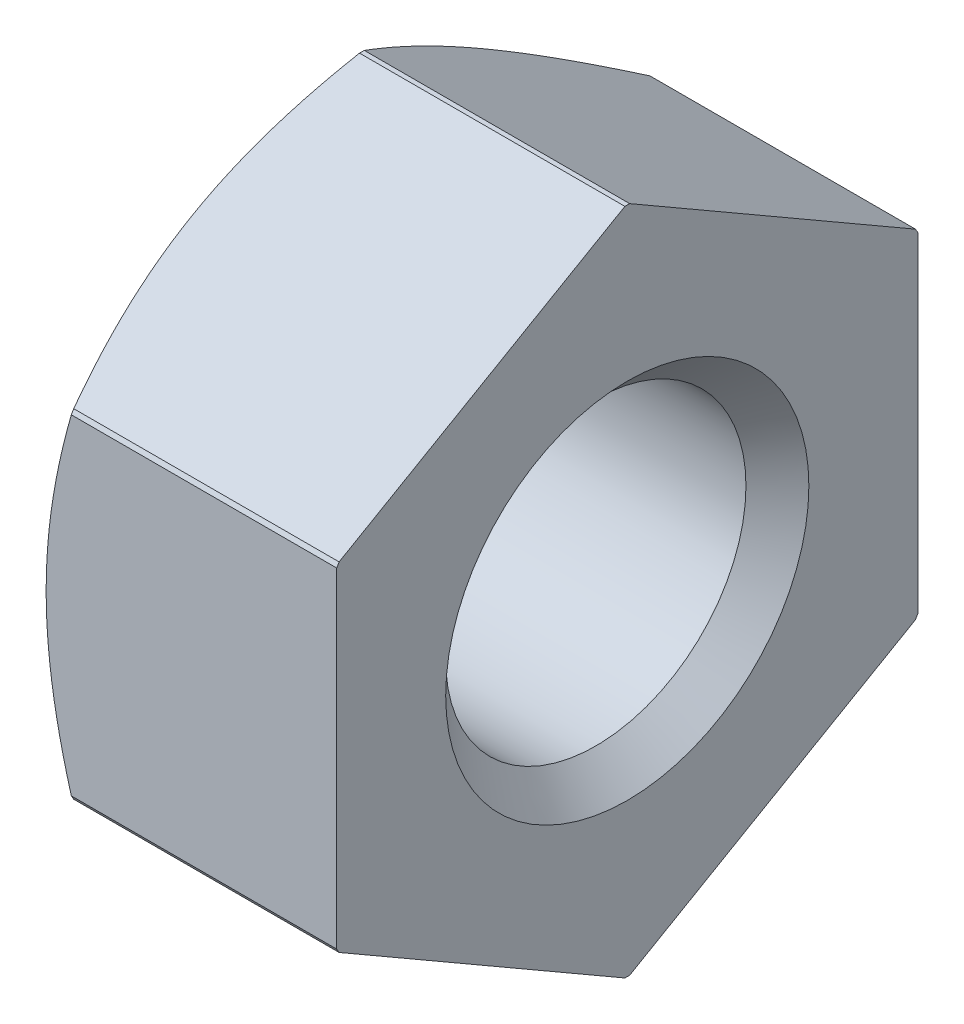
ISO-10303-21;
HEADER;
FILE_DESCRIPTION(('STEP AP214'),'2;1');
FILE_NAME('part.step','',(''),(''),'','','');
FILE_SCHEMA(('AUTOMOTIVE_DESIGN { 1 0 10303 214 1 1 1 1 }'));
ENDSEC;
DATA;
#1=APPLICATION_CONTEXT('core data for automotive mechanical design processes');
#2=APPLICATION_PROTOCOL_DEFINITION('international standard','automotive_design',2000,#1);
#3=PRODUCT_CONTEXT('',#1,'mechanical');
#4=PRODUCT('Part','Part','',(#3));
#5=PRODUCT_RELATED_PRODUCT_CATEGORY('part','',(#4));
#6=PRODUCT_DEFINITION_FORMATION('','',#4);
#7=PRODUCT_DEFINITION_CONTEXT('part definition',#1,'design');
#8=PRODUCT_DEFINITION('design','',#6,#7);
#9=PRODUCT_DEFINITION_SHAPE('','',#8);
#10=(LENGTH_UNIT() NAMED_UNIT(*) SI_UNIT(.MILLI.,.METRE.));
#11=(NAMED_UNIT(*) PLANE_ANGLE_UNIT() SI_UNIT($,.RADIAN.));
#12=(NAMED_UNIT(*) SI_UNIT($,.STERADIAN.) SOLID_ANGLE_UNIT());
#13=UNCERTAINTY_MEASURE_WITH_UNIT(LENGTH_MEASURE(1.E-05),#10,'distance_accuracy_value','');
#14=(GEOMETRIC_REPRESENTATION_CONTEXT(3) GLOBAL_UNCERTAINTY_ASSIGNED_CONTEXT((#13)) GLOBAL_UNIT_ASSIGNED_CONTEXT((#10,
#11,#12)) REPRESENTATION_CONTEXT('',''));
#15=CARTESIAN_POINT('',(0.,0.,0.));
#16=DIRECTION('',(0.,0.,1.));
#17=DIRECTION('',(1.,0.,0.));
#18=AXIS2_PLACEMENT_3D('',#15,#16,#17);
#19=CARTESIAN_POINT('',(-2.,2.,0.));
#20=DIRECTION('',(-1.,0.,0.));
#21=DIRECTION('',(0.,0.,1.));
#22=AXIS2_PLACEMENT_3D('',#19,#20,#21);
#23=PLANE('',#22);
#24=CARTESIAN_POINT('',(-2.00000000000955,0.,0.));
#25=DIRECTION('',(1.,0.,0.));
#26=DIRECTION('',(0.,0.,-1.));
#27=AXIS2_PLACEMENT_3D('',#24,#25,#26);
#28=CIRCLE('',#27,3.99999999996226);
#29=CARTESIAN_POINT('',(-1.99999999999865,0.,3.99999999998113));
#30=VERTEX_POINT('',#29);
#31=CARTESIAN_POINT('',(-1.99999999999865,-3.46410161512141,1.99999999999056));
#32=VERTEX_POINT('',#31);
#33=EDGE_CURVE('E335',#30,#32,#28,.T.);
#34=ORIENTED_EDGE('',*,*,#33,.F.);
#35=CARTESIAN_POINT('',(-2.00000000000955,0.,0.));
#36=DIRECTION('',(1.,0.,0.));
#37=DIRECTION('',(0.,0.,-1.));
#38=AXIS2_PLACEMENT_3D('',#35,#36,#37);
#39=CIRCLE('',#38,3.99999999996226);
#40=CARTESIAN_POINT('',(-1.99999999999865,3.46410161512141,1.99999999999057));
#41=VERTEX_POINT('',#40);
#42=EDGE_CURVE('E144',#41,#30,#39,.T.);
#43=ORIENTED_EDGE('',*,*,#42,.F.);
#44=CARTESIAN_POINT('',(-2.00000000000955,0.,0.));
#45=DIRECTION('',(1.,0.,0.));
#46=DIRECTION('',(0.,0.,-1.));
#47=AXIS2_PLACEMENT_3D('',#44,#45,#46);
#48=CIRCLE('',#47,3.99999999996226);
#49=CARTESIAN_POINT('',(-1.99999999999865,3.46410161512141,-1.99999999999056));
#50=VERTEX_POINT('',#49);
#51=EDGE_CURVE('E138',#50,#41,#48,.T.);
#52=ORIENTED_EDGE('',*,*,#51,.F.);
#53=CARTESIAN_POINT('',(-2.00000000000955,0.,0.));
#54=DIRECTION('',(1.,0.,0.));
#55=DIRECTION('',(0.,0.,-1.));
#56=AXIS2_PLACEMENT_3D('',#53,#54,#55);
#57=CIRCLE('',#56,3.99999999996226);
#58=CARTESIAN_POINT('',(-1.99999999999865,0.,-3.99999999998113));
#59=VERTEX_POINT('',#58);
#60=EDGE_CURVE('E141',#59,#50,#57,.T.);
#61=ORIENTED_EDGE('',*,*,#60,.F.);
#62=CARTESIAN_POINT('',(-2.00000000000955,0.,0.));
#63=DIRECTION('',(1.,0.,0.));
#64=DIRECTION('',(0.,0.,-1.));
#65=AXIS2_PLACEMENT_3D('',#62,#63,#64);
#66=CIRCLE('',#65,3.99999999996226);
#67=CARTESIAN_POINT('',(-1.99999999999866,-3.46410161512141,-1.99999999999056));
#68=VERTEX_POINT('',#67);
#69=EDGE_CURVE('E160',#68,#59,#66,.T.);
#70=ORIENTED_EDGE('',*,*,#69,.F.);
#71=CARTESIAN_POINT('',(-2.00000000000955,0.,0.));
#72=DIRECTION('',(1.,0.,0.));
#73=DIRECTION('',(0.,0.,-1.));
#74=AXIS2_PLACEMENT_3D('',#71,#72,#73);
#75=CIRCLE('',#74,3.99999999996226);
#76=EDGE_CURVE('E319',#32,#68,#75,.T.);
#77=ORIENTED_EDGE('',*,*,#76,.F.);
#78=EDGE_LOOP('',(#34,#43,#52,#61,#70,#77));
#79=FACE_BOUND('',#78,.T.);
#80=CARTESIAN_POINT('',(-2.00000000000955,0.,0.));
#81=DIRECTION('',(-1.,0.,0.));
#82=DIRECTION('',(0.,0.,1.));
#83=AXIS2_PLACEMENT_3D('',#80,#81,#82);
#84=CIRCLE('',#83,2.49999999999773);
#85=CARTESIAN_POINT('',(-2.00000000000955,0.,2.49999999999773));
#86=VERTEX_POINT('',#85);
#87=EDGE_CURVE('E20',#86,#86,#84,.F.);
#88=ORIENTED_EDGE('',*,*,#87,.T.);
#89=EDGE_LOOP('',(#88));
#90=FACE_BOUND('',#89,.T.);
#91=ADVANCED_FACE('F17',(#79,#90),#23,.T.);
#92=CARTESIAN_POINT('',(-2.00000000006639,0.,0.));
#93=DIRECTION('',(-1.,0.,0.));
#94=DIRECTION('',(0.,0.,1.));
#95=AXIS2_PLACEMENT_3D('',#92,#93,#94);
#96=CONICAL_SURFACE('',#95,2.50000000005457,0.785398163397448);
#97=CARTESIAN_POINT('',(-1.567,0.,0.));
#98=DIRECTION('',(1.,0.,0.));
#99=DIRECTION('',(0.,0.,-1.));
#100=AXIS2_PLACEMENT_3D('',#97,#98,#99);
#101=CIRCLE('',#100,2.067);
#102=CARTESIAN_POINT('',(-1.567,0.,-2.067));
#103=VERTEX_POINT('',#102);
#104=EDGE_CURVE('E153',#103,#103,#101,.T.);
#105=ORIENTED_EDGE('',*,*,#104,.T.);
#106=EDGE_LOOP('',(#105));
#107=FACE_BOUND('',#106,.T.);
#108=ORIENTED_EDGE('',*,*,#87,.F.);
#109=EDGE_LOOP('',(#108));
#110=FACE_BOUND('',#109,.T.);
#111=ADVANCED_FACE('F411',(#107,#110),#96,.F.);
#112=CARTESIAN_POINT('',(-1.65358983849728,0.,0.));
#113=DIRECTION('',(1.,0.,0.));
#114=DIRECTION('',(0.,0.,-1.));
#115=AXIS2_PLACEMENT_3D('',#112,#113,#114);
#116=CONICAL_SURFACE('',#115,4.59999999998217,1.04719755121286);
#117=CARTESIAN_POINT('',(-1.99999999998618,3.46410161513539,1.99999999999864));
#118=CARTESIAN_POINT('',(-2.00001528982485,3.51228454323559,1.91654472047514));
#119=CARTESIAN_POINT('',(-1.99798980459572,3.56046529591652,1.83309320888629));
#120=CARTESIAN_POINT('',(-1.98997086315159,3.65673560713573,1.6663481385952));
#121=CARTESIAN_POINT('',(-1.98397814173186,3.70482518090798,1.58305455350695));
#122=CARTESIAN_POINT('',(-1.96817687570405,3.80060992221482,1.41715051497338));
#123=CARTESIAN_POINT('',(-1.95838709370351,3.84830586925309,1.3345387113881));
#124=CARTESIAN_POINT('',(-1.93519618314512,3.94347716290588,1.16969719535948));
#125=CARTESIAN_POINT('',(-1.92179496829751,3.99095250422179,1.08746749209362));
#126=CARTESIAN_POINT('',(-1.87657493968299,4.13285817557247,0.841679659432025));
#127=CARTESIAN_POINT('',(-1.83971891567536,4.22688754609482,0.678816012283612));
#128=CARTESIAN_POINT('',(-1.75463489372951,4.41415290148489,0.354462902250597));
#129=CARTESIAN_POINT('',(-1.70635141411298,4.50738264048925,0.192984257518677));
#130=CARTESIAN_POINT('',(-1.65358983848693,4.59988328429791,0.0327684427092212));
#131=B_SPLINE_CURVE_WITH_KNOTS('',3,(#117,#118,#119,#120,#121,#122,#123,#124,#125,#126,#127,
#128,#129,#130),.UNSPECIFIED.,.F.,.F.,(4,2,2,2,2,2,4),(0.,0.289069278708792,0.578085032160999,
0.865690487404775,1.15330281515855,1.72781024307218,2.3051663615993),.UNSPECIFIED.);
#132=CARTESIAN_POINT('',(-1.65358983848658,4.59988328429786,0.032768442709309));
#133=VERTEX_POINT('',#132);
#134=EDGE_CURVE('E273',#41,#133,#131,.T.);
#135=ORIENTED_EDGE('',*,*,#134,.T.);
#136=CARTESIAN_POINT('',(-1.65358983848622,0.,0.));
#137=DIRECTION('',(1.,0.,0.));
#138=DIRECTION('',(0.,0.,-1.));
#139=AXIS2_PLACEMENT_3D('',#136,#137,#138);
#140=CIRCLE('',#139,4.6);
#141=CARTESIAN_POINT('',(-1.6535898384866,4.59988328429781,-0.0327684427094049));
#142=VERTEX_POINT('',#141);
#143=EDGE_CURVE('E134',#142,#133,#140,.T.);
#144=ORIENTED_EDGE('',*,*,#143,.F.);
#145=CARTESIAN_POINT('',(-1.65358983848693,4.59988328429791,-0.0327684427092265));
#146=CARTESIAN_POINT('',(-1.70635141411296,4.50738264048926,-0.192984257518654));
#147=CARTESIAN_POINT('',(-1.75463489372949,4.41415290148492,-0.354462902250555));
#148=CARTESIAN_POINT('',(-1.83971891567534,4.22688754609488,-0.678816012283549));
#149=CARTESIAN_POINT('',(-1.87657493968298,4.13285817557254,-0.841679659431959));
#150=CARTESIAN_POINT('',(-1.92179496829748,3.99095250422185,-1.08746749209352));
#151=CARTESIAN_POINT('',(-1.93519618314509,3.94347716290594,-1.16969719535935));
#152=CARTESIAN_POINT('',(-1.9583870937035,3.8483058692532,-1.33453871138796));
#153=CARTESIAN_POINT('',(-1.96817687570406,3.80060992221498,-1.41715051497326));
#154=CARTESIAN_POINT('',(-1.9839781417318,3.70482518090805,-1.58305455350671));
#155=CARTESIAN_POINT('',(-1.98997086315142,3.65673560713565,-1.66634813859485));
#156=CARTESIAN_POINT('',(-1.99798980459586,3.56046529591693,-1.83309320888613));
#157=CARTESIAN_POINT('',(-2.00001528982541,3.51228454323664,-1.9165447204753));
#158=CARTESIAN_POINT('',(-1.99999999998776,3.46410161513798,-1.99999999999961));
#159=B_SPLINE_CURVE_WITH_KNOTS('',3,(#145,#146,#147,#148,#149,#150,#151,#152,#153,#154,#155,
#156,#157,#158),.UNSPECIFIED.,.F.,.F.,(4,2,2,2,2,2,4),(0.,0.577356118527042,1.15186354644065,
1.43947587419436,1.72708132943809,2.01609708289021,2.30516636159888),.UNSPECIFIED.);
#160=EDGE_CURVE('E148',#142,#50,#159,.T.);
#161=ORIENTED_EDGE('',*,*,#160,.T.);
#162=ORIENTED_EDGE('',*,*,#51,.T.);
#163=EDGE_LOOP('',(#135,#144,#161,#162));
#164=FACE_BOUND('',#163,.T.);
#165=ADVANCED_FACE('F149',(#164),#116,.T.);
#166=CARTESIAN_POINT('',(0.173205080756888,0.,0.));
#167=DIRECTION('',(1.,0.,0.));
#168=DIRECTION('',(0.,0.,-1.));
#169=AXIS2_PLACEMENT_3D('',#166,#167,#168);
#170=CYLINDRICAL_SURFACE('',#169,4.6);
#171=DIRECTION('',(1.,0.,0.));
#172=VECTOR('',#171,1.);
#173=CARTESIAN_POINT('',(2.,4.59988328429781,0.0327684427093968));
#174=LINE('',#173,#172);
#175=CARTESIAN_POINT('',(2.,4.59988328429781,0.0327684427093985));
#176=VERTEX_POINT('',#175);
#177=EDGE_CURVE('E378',#133,#176,#174,.T.);
#178=ORIENTED_EDGE('',*,*,#177,.T.);
#179=CARTESIAN_POINT('',(2.,0.,0.));
#180=DIRECTION('',(1.,0.,0.));
#181=DIRECTION('',(0.,0.,-1.));
#182=AXIS2_PLACEMENT_3D('',#179,#180,#181);
#183=CIRCLE('',#182,4.6);
#184=CARTESIAN_POINT('',(2.,4.59988328429781,-0.032768442709401));
#185=VERTEX_POINT('',#184);
#186=EDGE_CURVE('E96',#176,#185,#183,.F.);
#187=ORIENTED_EDGE('',*,*,#186,.T.);
#188=DIRECTION('',(1.,0.,0.));
#189=VECTOR('',#188,1.);
#190=CARTESIAN_POINT('',(2.,4.59988328429781,-0.0327684427094017));
#191=LINE('',#190,#189);
#192=EDGE_CURVE('E168',#185,#142,#191,.F.);
#193=ORIENTED_EDGE('',*,*,#192,.T.);
#194=ORIENTED_EDGE('',*,*,#143,.T.);
#195=EDGE_LOOP('',(#178,#187,#193,#194));
#196=FACE_BOUND('',#195,.T.);
#197=ADVANCED_FACE('F404',(#196),#170,.T.);
#198=CARTESIAN_POINT('',(-1.65358983849728,0.,0.));
#199=DIRECTION('',(1.,0.,0.));
#200=DIRECTION('',(0.,0.,-1.));
#201=AXIS2_PLACEMENT_3D('',#198,#199,#200);
#202=CONICAL_SURFACE('',#201,4.59999999998217,1.04719755121286);
#203=CARTESIAN_POINT('',(-1.65358983848693,2.3283199459776,3.96723155729077));
#204=CARTESIAN_POINT('',(-1.70635141411297,2.42082058978626,3.80701574248135));
#205=CARTESIAN_POINT('',(-1.7546348937295,2.51405032879059,3.64553709774945));
#206=CARTESIAN_POINT('',(-1.83971891567535,2.70131568418063,3.32118398771645));
#207=CARTESIAN_POINT('',(-1.87657493968298,2.79534505470297,3.15832034056804));
#208=CARTESIAN_POINT('',(-1.92179496829749,2.93725072605366,2.91253250790648));
#209=CARTESIAN_POINT('',(-1.93519618314509,2.98472606736957,2.83030280464065));
#210=CARTESIAN_POINT('',(-1.9583870937035,3.07989736102231,2.66546128861204));
#211=CARTESIAN_POINT('',(-1.96817687570407,3.12759330806053,2.58284948502674));
#212=CARTESIAN_POINT('',(-1.98397814173181,3.22337804936746,2.41694544649329));
#213=CARTESIAN_POINT('',(-1.98997086315142,3.27146762313986,2.33365186140516));
#214=CARTESIAN_POINT('',(-1.99798980459586,3.36773793435858,2.16690679111387));
#215=CARTESIAN_POINT('',(-2.00001528982541,3.41591868703887,2.0834552795247));
#216=CARTESIAN_POINT('',(-1.99999999998776,3.46410161513753,2.00000000000039));
#217=B_SPLINE_CURVE_WITH_KNOTS('',3,(#203,#204,#205,#206,#207,#208,#209,#210,#211,#212,#213,
#214,#215,#216),.UNSPECIFIED.,.F.,.F.,(4,2,2,2,2,2,4),(0.,0.577356118527042,1.15186354644065,
1.43947587419436,1.72708132943809,2.01609708289021,2.30516636159888),.UNSPECIFIED.);
#218=CARTESIAN_POINT('',(-1.65358983848661,2.3283199459777,3.9672315572906));
#219=VERTEX_POINT('',#218);
#220=EDGE_CURVE('E176',#219,#41,#217,.T.);
#221=ORIENTED_EDGE('',*,*,#220,.T.);
#222=ORIENTED_EDGE('',*,*,#42,.T.);
#223=CARTESIAN_POINT('',(-1.99999999998618,0.,3.99999999999727));
#224=CARTESIAN_POINT('',(-2.00001528982485,0.0963658561973798,3.99999999999902));
#225=CARTESIAN_POINT('',(-1.99798980459572,0.192727361557999,3.99999999999974));
#226=CARTESIAN_POINT('',(-1.98997086315159,0.385267983995511,4.00000000000026));
#227=CARTESIAN_POINT('',(-1.98397814173186,0.481447131540342,4.00000000000007));
#228=CARTESIAN_POINT('',(-1.96817687570404,0.673016614154261,3.99999999999993));
#229=CARTESIAN_POINT('',(-1.95838709370351,0.768408508230703,3.99999999999998));
#230=CARTESIAN_POINT('',(-1.93519618314512,0.958751095536223,4.00000000000002));
#231=CARTESIAN_POINT('',(-1.92179496829751,1.05370177816807,4.00000000000001));
#232=CARTESIAN_POINT('',(-1.87657493968299,1.33751312086947,3.99999999999999));
#233=CARTESIAN_POINT('',(-1.83971891567536,1.52557186191415,3.99999999999999));
#234=CARTESIAN_POINT('',(-1.75463489372951,1.90010257269427,4.00000000000001));
#235=CARTESIAN_POINT('',(-1.70635141411298,2.08656205070297,4.00000000000001));
#236=CARTESIAN_POINT('',(-1.65358983848693,2.27156333832031,4.));
#237=B_SPLINE_CURVE_WITH_KNOTS('',3,(#223,#224,#225,#226,#227,#228,#229,#230,#231,#232,#233,
#234,#235,#236),.UNSPECIFIED.,.F.,.F.,(4,2,2,2,2,2,4),(0.,0.289069278708791,0.578085032160998,
0.865690487404773,1.15330281515855,1.72781024307218,2.3051663615993),.UNSPECIFIED.);
#238=CARTESIAN_POINT('',(-1.65358983848658,2.27156333832021,4.));
#239=VERTEX_POINT('',#238);
#240=EDGE_CURVE('E268',#30,#239,#237,.T.);
#241=ORIENTED_EDGE('',*,*,#240,.T.);
#242=CARTESIAN_POINT('',(-1.65358983848622,0.,0.));
#243=DIRECTION('',(1.,0.,0.));
#244=DIRECTION('',(0.,0.,-1.));
#245=AXIS2_PLACEMENT_3D('',#242,#243,#244);
#246=CIRCLE('',#245,4.6);
#247=EDGE_CURVE('E332',#219,#239,#246,.T.);
#248=ORIENTED_EDGE('',*,*,#247,.F.);
#249=EDGE_LOOP('',(#221,#222,#241,#248));
#250=FACE_BOUND('',#249,.T.);
#251=ADVANCED_FACE('F361',(#250),#202,.T.);
#252=CARTESIAN_POINT('',(0.173205080756888,0.,0.));
#253=DIRECTION('',(1.,0.,0.));
#254=DIRECTION('',(0.,0.,-1.));
#255=AXIS2_PLACEMENT_3D('',#252,#253,#254);
#256=CYLINDRICAL_SURFACE('',#255,4.6);
#257=DIRECTION('',(1.,0.,0.));
#258=VECTOR('',#257,1.);
#259=CARTESIAN_POINT('',(2.,2.3283199459777,3.9672315572906));
#260=LINE('',#259,#258);
#261=CARTESIAN_POINT('',(2.,2.3283199459777,3.9672315572906));
#262=VERTEX_POINT('',#261);
#263=EDGE_CURVE('E269',#262,#219,#260,.F.);
#264=ORIENTED_EDGE('',*,*,#263,.T.);
#265=ORIENTED_EDGE('',*,*,#247,.T.);
#266=DIRECTION('',(-1.,0.,0.));
#267=VECTOR('',#266,1.);
#268=CARTESIAN_POINT('',(2.,2.27156333832011,4.));
#269=LINE('',#268,#267);
#270=CARTESIAN_POINT('',(2.,2.27156333832011,4.));
#271=VERTEX_POINT('',#270);
#272=EDGE_CURVE('E368',#239,#271,#269,.F.);
#273=ORIENTED_EDGE('',*,*,#272,.T.);
#274=CARTESIAN_POINT('',(2.,0.,0.));
#275=DIRECTION('',(1.,0.,0.));
#276=DIRECTION('',(0.,0.,-1.));
#277=AXIS2_PLACEMENT_3D('',#274,#275,#276);
#278=CIRCLE('',#277,4.6);
#279=EDGE_CURVE('E336',#271,#262,#278,.F.);
#280=ORIENTED_EDGE('',*,*,#279,.T.);
#281=EDGE_LOOP('',(#264,#265,#273,#280));
#282=FACE_BOUND('',#281,.T.);
#283=ADVANCED_FACE('F259',(#282),#256,.T.);
#284=CARTESIAN_POINT('',(-1.65358983849728,0.,0.));
#285=DIRECTION('',(1.,0.,0.));
#286=DIRECTION('',(0.,0.,-1.));
#287=AXIS2_PLACEMENT_3D('',#284,#285,#286);
#288=CONICAL_SURFACE('',#287,4.59999999998217,1.04719755121286);
#289=CARTESIAN_POINT('',(-1.65358983848693,-2.27156333832031,4.));
#290=CARTESIAN_POINT('',(-1.70635141411297,-2.086562050703,4.));
#291=CARTESIAN_POINT('',(-1.75463489372949,-1.90010257269432,4.));
#292=CARTESIAN_POINT('',(-1.83971891567534,-1.52557186191424,4.));
#293=CARTESIAN_POINT('',(-1.87657493968298,-1.33751312086956,4.));
#294=CARTESIAN_POINT('',(-1.92179496829748,-1.05370177816818,4.));
#295=CARTESIAN_POINT('',(-1.93519618314509,-0.958751095536359,4.));
#296=CARTESIAN_POINT('',(-1.9583870937035,-0.768408508230876,4.));
#297=CARTESIAN_POINT('',(-1.96817687570407,-0.673016614154452,4.));
#298=CARTESIAN_POINT('',(-1.9839781417318,-0.481447131540577,4.));
#299=CARTESIAN_POINT('',(-1.98997086315142,-0.385267983995773,4.));
#300=CARTESIAN_POINT('',(-1.99798980459586,-0.192727361558338,4.));
#301=CARTESIAN_POINT('',(-2.00001528982541,-0.0963658561977672,4.));
#302=CARTESIAN_POINT('',(-1.99999999998776,-4.49006557936759E-13,4.));
#303=B_SPLINE_CURVE_WITH_KNOTS('',3,(#289,#290,#291,#292,#293,#294,#295,#296,#297,#298,#299,
#300,#301,#302),.UNSPECIFIED.,.F.,.F.,(4,2,2,2,2,2,4),(0.,0.577356118527042,1.15186354644065,
1.43947587419436,1.72708132943809,2.01609708289021,2.30516636159888),.UNSPECIFIED.);
#304=CARTESIAN_POINT('',(-1.65358983848661,-2.27156333832011,4.));
#305=VERTEX_POINT('',#304);
#306=EDGE_CURVE('E263',#305,#30,#303,.T.);
#307=ORIENTED_EDGE('',*,*,#306,.T.);
#308=ORIENTED_EDGE('',*,*,#33,.T.);
#309=CARTESIAN_POINT('',(-1.99999999998618,-3.46410161513539,1.99999999999864));
#310=CARTESIAN_POINT('',(-2.00001528982485,-3.41591868703822,2.08345527952388));
#311=CARTESIAN_POINT('',(-1.99798980459572,-3.36773793435853,2.16690679111344));
#312=CARTESIAN_POINT('',(-1.98997086315159,-3.27146762314023,2.33365186140506));
#313=CARTESIAN_POINT('',(-1.98397814173186,-3.22337804936765,2.41694544649312));
#314=CARTESIAN_POINT('',(-1.96817687570404,-3.12759330806057,2.58284948502654));
#315=CARTESIAN_POINT('',(-1.95838709370351,-3.07989736102239,2.66546128861188));
#316=CARTESIAN_POINT('',(-1.93519618314512,-2.98472606736967,2.83030280464054));
#317=CARTESIAN_POINT('',(-1.9217949682975,-2.93725072605373,2.91253250790638));
#318=CARTESIAN_POINT('',(-1.87657493968299,-2.79534505470301,3.15832034056796));
#319=CARTESIAN_POINT('',(-1.83971891567535,-2.70131568418068,3.32118398771638));
#320=CARTESIAN_POINT('',(-1.75463489372951,-2.51405032879063,3.64553709774941));
#321=CARTESIAN_POINT('',(-1.70635141411298,-2.42082058978629,3.80701574248134));
#322=CARTESIAN_POINT('',(-1.65358983848693,-2.3283199459776,3.96723155729078));
#323=B_SPLINE_CURVE_WITH_KNOTS('',3,(#309,#310,#311,#312,#313,#314,#315,#316,#317,#318,#319,
#320,#321,#322),.UNSPECIFIED.,.F.,.F.,(4,2,2,2,2,2,4),(0.,0.289069278708791,0.578085032160999,
0.865690487404773,1.15330281515855,1.72781024307218,2.3051663615993),.UNSPECIFIED.);
#324=CARTESIAN_POINT('',(-1.65358983848658,-2.32831994597765,3.96723155729069));
#325=VERTEX_POINT('',#324);
#326=EDGE_CURVE('E241',#32,#325,#323,.T.);
#327=ORIENTED_EDGE('',*,*,#326,.T.);
#328=CARTESIAN_POINT('',(-1.65358983848622,0.,0.));
#329=DIRECTION('',(1.,0.,0.));
#330=DIRECTION('',(0.,0.,-1.));
#331=AXIS2_PLACEMENT_3D('',#328,#329,#330);
#332=CIRCLE('',#331,4.6);
#333=EDGE_CURVE('E325',#305,#325,#332,.T.);
#334=ORIENTED_EDGE('',*,*,#333,.F.);
#335=EDGE_LOOP('',(#307,#308,#327,#334));
#336=FACE_BOUND('',#335,.T.);
#337=ADVANCED_FACE('F253',(#336),#288,.T.);
#338=CARTESIAN_POINT('',(0.173205080756888,0.,0.));
#339=DIRECTION('',(1.,0.,0.));
#340=DIRECTION('',(0.,0.,-1.));
#341=AXIS2_PLACEMENT_3D('',#338,#339,#340);
#342=CYLINDRICAL_SURFACE('',#341,4.6);
#343=DIRECTION('',(-1.,0.,0.));
#344=VECTOR('',#343,1.);
#345=CARTESIAN_POINT('',(2.,-2.27156333832011,4.));
#346=LINE('',#345,#344);
#347=CARTESIAN_POINT('',(2.,-2.27156333832011,4.));
#348=VERTEX_POINT('',#347);
#349=EDGE_CURVE('E369',#348,#305,#346,.T.);
#350=ORIENTED_EDGE('',*,*,#349,.T.);
#351=ORIENTED_EDGE('',*,*,#333,.T.);
#352=DIRECTION('',(1.,0.,0.));
#353=VECTOR('',#352,1.);
#354=CARTESIAN_POINT('',(2.,-2.3283199459777,3.9672315572906));
#355=LINE('',#354,#353);
#356=CARTESIAN_POINT('',(2.,-2.3283199459777,3.9672315572906));
#357=VERTEX_POINT('',#356);
#358=EDGE_CURVE('E247',#325,#357,#355,.T.);
#359=ORIENTED_EDGE('',*,*,#358,.T.);
#360=CARTESIAN_POINT('',(2.,0.,0.));
#361=DIRECTION('',(1.,0.,0.));
#362=DIRECTION('',(0.,0.,-1.));
#363=AXIS2_PLACEMENT_3D('',#360,#361,#362);
#364=CIRCLE('',#363,4.6);
#365=EDGE_CURVE('E328',#357,#348,#364,.F.);
#366=ORIENTED_EDGE('',*,*,#365,.T.);
#367=EDGE_LOOP('',(#350,#351,#359,#366));
#368=FACE_BOUND('',#367,.T.);
#369=ADVANCED_FACE('F258',(#368),#342,.T.);
#370=CARTESIAN_POINT('',(-1.65358983849728,0.,0.));
#371=DIRECTION('',(1.,0.,0.));
#372=DIRECTION('',(0.,0.,-1.));
#373=AXIS2_PLACEMENT_3D('',#370,#371,#372);
#374=CONICAL_SURFACE('',#373,4.59999999998217,1.04719755121286);
#375=CARTESIAN_POINT('',(-1.99999999998618,-3.46410161513539,-1.99999999999863));
#376=CARTESIAN_POINT('',(-2.00001528982485,-3.51228454323559,-1.91654472047514));
#377=CARTESIAN_POINT('',(-1.99798980459572,-3.56046529591652,-1.83309320888629));
#378=CARTESIAN_POINT('',(-1.98997086315159,-3.65673560713573,-1.6663481385952));
#379=CARTESIAN_POINT('',(-1.98397814173186,-3.70482518090798,-1.58305455350695));
#380=CARTESIAN_POINT('',(-1.96817687570405,-3.80060992221482,-1.41715051497338));
#381=CARTESIAN_POINT('',(-1.95838709370351,-3.84830586925309,-1.3345387113881));
#382=CARTESIAN_POINT('',(-1.93519618314512,-3.94347716290588,-1.16969719535948));
#383=CARTESIAN_POINT('',(-1.92179496829751,-3.99095250422179,-1.08746749209362));
#384=CARTESIAN_POINT('',(-1.87657493968299,-4.13285817557247,-0.841679659432025));
#385=CARTESIAN_POINT('',(-1.83971891567536,-4.22688754609482,-0.678816012283612));
#386=CARTESIAN_POINT('',(-1.75463489372951,-4.41415290148489,-0.354462902250597));
#387=CARTESIAN_POINT('',(-1.70635141411298,-4.50738264048925,-0.192984257518677));
#388=CARTESIAN_POINT('',(-1.65358983848693,-4.59988328429791,-0.0327684427092202));
#389=B_SPLINE_CURVE_WITH_KNOTS('',3,(#375,#376,#377,#378,#379,#380,#381,#382,#383,#384,#385,
#386,#387,#388),.UNSPECIFIED.,.F.,.F.,(4,2,2,2,2,2,4),(0.,0.289069278708792,0.578085032160999,
0.865690487404774,1.15330281515855,1.72781024307218,2.3051663615993),.UNSPECIFIED.);
#390=CARTESIAN_POINT('',(-1.65358983848658,-4.59988328429786,-0.032768442709309));
#391=VERTEX_POINT('',#390);
#392=EDGE_CURVE('E211',#68,#391,#389,.T.);
#393=ORIENTED_EDGE('',*,*,#392,.T.);
#394=CARTESIAN_POINT('',(-1.65358983848623,0.,0.));
#395=DIRECTION('',(1.,0.,0.));
#396=DIRECTION('',(0.,0.,-1.));
#397=AXIS2_PLACEMENT_3D('',#394,#395,#396);
#398=CIRCLE('',#397,4.6);
#399=CARTESIAN_POINT('',(-1.6535898384866,-4.59988328429781,0.0327684427094049));
#400=VERTEX_POINT('',#399);
#401=EDGE_CURVE('E316',#400,#391,#398,.T.);
#402=ORIENTED_EDGE('',*,*,#401,.F.);
#403=CARTESIAN_POINT('',(-1.65358983848693,-4.59988328429791,0.0327684427092264));
#404=CARTESIAN_POINT('',(-1.70635141411296,-4.50738264048926,0.192984257518654));
#405=CARTESIAN_POINT('',(-1.75463489372949,-4.41415290148492,0.354462902250555));
#406=CARTESIAN_POINT('',(-1.83971891567534,-4.22688754609488,0.678816012283548));
#407=CARTESIAN_POINT('',(-1.87657493968298,-4.13285817557254,0.841679659431958));
#408=CARTESIAN_POINT('',(-1.92179496829748,-3.99095250422185,1.08746749209352));
#409=CARTESIAN_POINT('',(-1.93519618314509,-3.94347716290594,1.16969719535935));
#410=CARTESIAN_POINT('',(-1.9583870937035,-3.8483058692532,1.33453871138796));
#411=CARTESIAN_POINT('',(-1.96817687570406,-3.80060992221498,1.41715051497326));
#412=CARTESIAN_POINT('',(-1.9839781417318,-3.70482518090805,1.58305455350671));
#413=CARTESIAN_POINT('',(-1.98997086315142,-3.65673560713565,1.66634813859484));
#414=CARTESIAN_POINT('',(-1.99798980459586,-3.56046529591693,1.83309320888613));
#415=CARTESIAN_POINT('',(-2.00001528982541,-3.51228454323664,1.9165447204753));
#416=CARTESIAN_POINT('',(-1.99999999998776,-3.46410161513798,1.99999999999961));
#417=B_SPLINE_CURVE_WITH_KNOTS('',3,(#403,#404,#405,#406,#407,#408,#409,#410,#411,#412,#413,
#414,#415,#416),.UNSPECIFIED.,.F.,.F.,(4,2,2,2,2,2,4),(0.,0.577356118527041,1.15186354644065,
1.43947587419436,1.72708132943809,2.01609708289021,2.30516636159888),.UNSPECIFIED.);
#418=EDGE_CURVE('E248',#400,#32,#417,.T.);
#419=ORIENTED_EDGE('',*,*,#418,.T.);
#420=ORIENTED_EDGE('',*,*,#76,.T.);
#421=EDGE_LOOP('',(#393,#402,#419,#420));
#422=FACE_BOUND('',#421,.T.);
#423=ADVANCED_FACE('F472',(#422),#374,.T.);
#424=CARTESIAN_POINT('',(0.173205080756888,0.,0.));
#425=DIRECTION('',(1.,0.,0.));
#426=DIRECTION('',(0.,0.,-1.));
#427=AXIS2_PLACEMENT_3D('',#424,#425,#426);
#428=CYLINDRICAL_SURFACE('',#427,4.6);
#429=DIRECTION('',(1.,0.,0.));
#430=VECTOR('',#429,1.);
#431=CARTESIAN_POINT('',(2.,-4.59988328429781,-0.0327684427093968));
#432=LINE('',#431,#430);
#433=CARTESIAN_POINT('',(2.,-4.59988328429781,-0.0327684427093985));
#434=VERTEX_POINT('',#433);
#435=EDGE_CURVE('E390',#391,#434,#432,.T.);
#436=ORIENTED_EDGE('',*,*,#435,.T.);
#437=CARTESIAN_POINT('',(2.,0.,0.));
#438=DIRECTION('',(1.,0.,0.));
#439=DIRECTION('',(0.,0.,-1.));
#440=AXIS2_PLACEMENT_3D('',#437,#438,#439);
#441=CIRCLE('',#440,4.6);
#442=CARTESIAN_POINT('',(2.,-4.59988328429781,0.032768442709401));
#443=VERTEX_POINT('',#442);
#444=EDGE_CURVE('E161',#434,#443,#441,.F.);
#445=ORIENTED_EDGE('',*,*,#444,.T.);
#446=DIRECTION('',(1.,0.,0.));
#447=VECTOR('',#446,1.);
#448=CARTESIAN_POINT('',(2.,-4.59988328429781,0.0327684427094017));
#449=LINE('',#448,#447);
#450=EDGE_CURVE('E240',#443,#400,#449,.F.);
#451=ORIENTED_EDGE('',*,*,#450,.T.);
#452=ORIENTED_EDGE('',*,*,#401,.T.);
#453=EDGE_LOOP('',(#436,#445,#451,#452));
#454=FACE_BOUND('',#453,.T.);
#455=ADVANCED_FACE('F195',(#454),#428,.T.);
#456=CARTESIAN_POINT('',(-1.65358983849728,0.,0.));
#457=DIRECTION('',(1.,0.,0.));
#458=DIRECTION('',(0.,0.,-1.));
#459=AXIS2_PLACEMENT_3D('',#456,#457,#458);
#460=CONICAL_SURFACE('',#459,4.59999999998217,1.04719755121286);
#461=CARTESIAN_POINT('',(-1.65358983848693,2.27156333832031,-4.));
#462=CARTESIAN_POINT('',(-1.70635141411297,2.086562050703,-4.));
#463=CARTESIAN_POINT('',(-1.75463489372949,1.90010257269432,-4.));
#464=CARTESIAN_POINT('',(-1.83971891567534,1.52557186191424,-4.));
#465=CARTESIAN_POINT('',(-1.87657493968298,1.33751312086956,-4.));
#466=CARTESIAN_POINT('',(-1.92179496829748,1.05370177816818,-4.));
#467=CARTESIAN_POINT('',(-1.93519618314509,0.958751095536359,-4.));
#468=CARTESIAN_POINT('',(-1.9583870937035,0.768408508230876,-4.));
#469=CARTESIAN_POINT('',(-1.96817687570407,0.673016614154452,-4.));
#470=CARTESIAN_POINT('',(-1.9839781417318,0.481447131540577,-4.));
#471=CARTESIAN_POINT('',(-1.98997086315142,0.385267983995773,-4.));
#472=CARTESIAN_POINT('',(-1.99798980459586,0.192727361558337,-4.));
#473=CARTESIAN_POINT('',(-2.00001528982541,0.0963658561977669,-4.));
#474=CARTESIAN_POINT('',(-1.99999999998776,4.48423746329388E-13,-4.));
#475=B_SPLINE_CURVE_WITH_KNOTS('',3,(#461,#462,#463,#464,#465,#466,#467,#468,#469,#470,#471,
#472,#473,#474),.UNSPECIFIED.,.F.,.F.,(4,2,2,2,2,2,4),(0.,0.577356118527042,1.15186354644065,
1.43947587419436,1.72708132943809,2.01609708289021,2.30516636159888),.UNSPECIFIED.);
#476=CARTESIAN_POINT('',(-1.65358983848661,2.27156333832011,-4.));
#477=VERTEX_POINT('',#476);
#478=EDGE_CURVE('E159',#477,#59,#475,.T.);
#479=ORIENTED_EDGE('',*,*,#478,.T.);
#480=ORIENTED_EDGE('',*,*,#60,.T.);
#481=CARTESIAN_POINT('',(-1.99999999998618,3.46410161513539,-1.99999999999864));
#482=CARTESIAN_POINT('',(-2.00001528982485,3.41591868703822,-2.08345527952388));
#483=CARTESIAN_POINT('',(-1.99798980459572,3.36773793435853,-2.16690679111344));
#484=CARTESIAN_POINT('',(-1.98997086315159,3.27146762314023,-2.33365186140506));
#485=CARTESIAN_POINT('',(-1.98397814173186,3.22337804936765,-2.41694544649312));
#486=CARTESIAN_POINT('',(-1.96817687570404,3.12759330806057,-2.58284948502654));
#487=CARTESIAN_POINT('',(-1.95838709370351,3.07989736102239,-2.66546128861188));
#488=CARTESIAN_POINT('',(-1.93519618314512,2.98472606736967,-2.83030280464054));
#489=CARTESIAN_POINT('',(-1.9217949682975,2.93725072605373,-2.91253250790638));
#490=CARTESIAN_POINT('',(-1.87657493968299,2.79534505470301,-3.15832034056796));
#491=CARTESIAN_POINT('',(-1.83971891567535,2.70131568418068,-3.32118398771638));
#492=CARTESIAN_POINT('',(-1.75463489372951,2.51405032879063,-3.64553709774941));
#493=CARTESIAN_POINT('',(-1.70635141411298,2.42082058978629,-3.80701574248134));
#494=CARTESIAN_POINT('',(-1.65358983848693,2.3283199459776,-3.96723155729078));
#495=B_SPLINE_CURVE_WITH_KNOTS('',3,(#481,#482,#483,#484,#485,#486,#487,#488,#489,#490,#491,
#492,#493,#494),.UNSPECIFIED.,.F.,.F.,(4,2,2,2,2,2,4),(0.,0.289069278708791,0.578085032160999,
0.865690487404773,1.15330281515855,1.72781024307218,2.3051663615993),.UNSPECIFIED.);
#496=CARTESIAN_POINT('',(-1.65358983848658,2.32831994597765,-3.96723155729069));
#497=VERTEX_POINT('',#496);
#498=EDGE_CURVE('E152',#50,#497,#495,.T.);
#499=ORIENTED_EDGE('',*,*,#498,.T.);
#500=CARTESIAN_POINT('',(-1.65358983848622,0.,0.));
#501=DIRECTION('',(1.,0.,0.));
#502=DIRECTION('',(0.,0.,-1.));
#503=AXIS2_PLACEMENT_3D('',#500,#501,#502);
#504=CIRCLE('',#503,4.6);
#505=EDGE_CURVE('E312',#477,#497,#504,.T.);
#506=ORIENTED_EDGE('',*,*,#505,.F.);
#507=EDGE_LOOP('',(#479,#480,#499,#506));
#508=FACE_BOUND('',#507,.T.);
#509=ADVANCED_FACE('F156',(#508),#460,.T.);
#510=CARTESIAN_POINT('',(-1.65358983849728,0.,0.));
#511=DIRECTION('',(1.,0.,0.));
#512=DIRECTION('',(0.,0.,-1.));
#513=AXIS2_PLACEMENT_3D('',#510,#511,#512);
#514=CONICAL_SURFACE('',#513,4.59999999998217,1.04719755121286);
#515=CARTESIAN_POINT('',(-1.65358983848693,-2.3283199459776,-3.96723155729077));
#516=CARTESIAN_POINT('',(-1.70635141411297,-2.42082058978625,-3.80701574248135));
#517=CARTESIAN_POINT('',(-1.7546348937295,-2.51405032879059,-3.64553709774945));
#518=CARTESIAN_POINT('',(-1.83971891567535,-2.70131568418063,-3.32118398771645));
#519=CARTESIAN_POINT('',(-1.87657493968298,-2.79534505470297,-3.15832034056804));
#520=CARTESIAN_POINT('',(-1.92179496829749,-2.93725072605366,-2.91253250790648));
#521=CARTESIAN_POINT('',(-1.93519618314509,-2.98472606736957,-2.83030280464065));
#522=CARTESIAN_POINT('',(-1.9583870937035,-3.07989736102231,-2.66546128861204));
#523=CARTESIAN_POINT('',(-1.96817687570407,-3.12759330806053,-2.58284948502674));
#524=CARTESIAN_POINT('',(-1.98397814173181,-3.22337804936746,-2.41694544649329));
#525=CARTESIAN_POINT('',(-1.98997086315142,-3.27146762313987,-2.33365186140515));
#526=CARTESIAN_POINT('',(-1.99798980459586,-3.36773793435858,-2.16690679111387));
#527=CARTESIAN_POINT('',(-2.00001528982541,-3.41591868703887,-2.0834552795247));
#528=CARTESIAN_POINT('',(-1.99999999998776,-3.46410161513753,-2.00000000000039));
#529=B_SPLINE_CURVE_WITH_KNOTS('',3,(#515,#516,#517,#518,#519,#520,#521,#522,#523,#524,#525,
#526,#527,#528),.UNSPECIFIED.,.F.,.F.,(4,2,2,2,2,2,4),(0.,0.577356118527042,1.15186354644065,
1.43947587419436,1.72708132943809,2.01609708289021,2.30516636159888),.UNSPECIFIED.);
#530=CARTESIAN_POINT('',(-1.65358983848661,-2.3283199459777,-3.9672315572906));
#531=VERTEX_POINT('',#530);
#532=EDGE_CURVE('E234',#531,#68,#529,.T.);
#533=ORIENTED_EDGE('',*,*,#532,.T.);
#534=ORIENTED_EDGE('',*,*,#69,.T.);
#535=CARTESIAN_POINT('',(-1.99999999998618,0.,-3.99999999999727));
#536=CARTESIAN_POINT('',(-2.00001528982485,-0.0963658561973804,-3.99999999999902));
#537=CARTESIAN_POINT('',(-1.99798980459572,-0.192727361558,-3.99999999999974));
#538=CARTESIAN_POINT('',(-1.98997086315159,-0.385267983995511,-4.00000000000026));
#539=CARTESIAN_POINT('',(-1.98397814173186,-0.481447131540342,-4.00000000000007));
#540=CARTESIAN_POINT('',(-1.96817687570404,-0.673016614154262,-3.99999999999993));
#541=CARTESIAN_POINT('',(-1.95838709370351,-0.768408508230703,-3.99999999999998));
#542=CARTESIAN_POINT('',(-1.93519618314512,-0.958751095536223,-4.00000000000002));
#543=CARTESIAN_POINT('',(-1.92179496829751,-1.05370177816807,-4.00000000000001));
#544=CARTESIAN_POINT('',(-1.87657493968299,-1.33751312086947,-3.99999999999999));
#545=CARTESIAN_POINT('',(-1.83971891567536,-1.52557186191415,-3.99999999999999));
#546=CARTESIAN_POINT('',(-1.75463489372951,-1.90010257269427,-4.00000000000001));
#547=CARTESIAN_POINT('',(-1.70635141411298,-2.08656205070297,-4.00000000000001));
#548=CARTESIAN_POINT('',(-1.65358983848693,-2.27156333832031,-4.));
#549=B_SPLINE_CURVE_WITH_KNOTS('',3,(#535,#536,#537,#538,#539,#540,#541,#542,#543,#544,#545,
#546,#547,#548),.UNSPECIFIED.,.F.,.F.,(4,2,2,2,2,2,4),(0.,0.289069278708792,0.578085032160999,
0.865690487404774,1.15330281515855,1.72781024307218,2.3051663615993),.UNSPECIFIED.);
#550=CARTESIAN_POINT('',(-1.65358983848658,-2.27156333832021,-4.));
#551=VERTEX_POINT('',#550);
#552=EDGE_CURVE('E107',#59,#551,#549,.T.);
#553=ORIENTED_EDGE('',*,*,#552,.T.);
#554=CARTESIAN_POINT('',(-1.65358983848622,0.,0.));
#555=DIRECTION('',(1.,0.,0.));
#556=DIRECTION('',(0.,0.,-1.));
#557=AXIS2_PLACEMENT_3D('',#554,#555,#556);
#558=CIRCLE('',#557,4.6);
#559=EDGE_CURVE('E314',#531,#551,#558,.T.);
#560=ORIENTED_EDGE('',*,*,#559,.F.);
#561=EDGE_LOOP('',(#533,#534,#553,#560));
#562=FACE_BOUND('',#561,.T.);
#563=ADVANCED_FACE('F194',(#562),#514,.T.);
#564=CARTESIAN_POINT('',(0.173205080756888,0.,0.));
#565=DIRECTION('',(1.,0.,0.));
#566=DIRECTION('',(0.,0.,-1.));
#567=AXIS2_PLACEMENT_3D('',#564,#565,#566);
#568=CYLINDRICAL_SURFACE('',#567,4.6);
#569=DIRECTION('',(1.,0.,0.));
#570=VECTOR('',#569,1.);
#571=CARTESIAN_POINT('',(2.,-2.3283199459777,-3.9672315572906));
#572=LINE('',#571,#570);
#573=CARTESIAN_POINT('',(2.,-2.3283199459777,-3.9672315572906));
#574=VERTEX_POINT('',#573);
#575=EDGE_CURVE('E207',#574,#531,#572,.F.);
#576=ORIENTED_EDGE('',*,*,#575,.T.);
#577=ORIENTED_EDGE('',*,*,#559,.T.);
#578=DIRECTION('',(1.,0.,0.));
#579=VECTOR('',#578,1.);
#580=CARTESIAN_POINT('',(2.,-2.27156333832011,-4.));
#581=LINE('',#580,#579);
#582=CARTESIAN_POINT('',(2.,-2.27156333832011,-4.));
#583=VERTEX_POINT('',#582);
#584=EDGE_CURVE('E384',#551,#583,#581,.T.);
#585=ORIENTED_EDGE('',*,*,#584,.T.);
#586=CARTESIAN_POINT('',(2.,0.,0.));
#587=DIRECTION('',(1.,0.,0.));
#588=DIRECTION('',(0.,0.,-1.));
#589=AXIS2_PLACEMENT_3D('',#586,#587,#588);
#590=CIRCLE('',#589,4.6);
#591=EDGE_CURVE('E303',#583,#574,#590,.F.);
#592=ORIENTED_EDGE('',*,*,#591,.T.);
#593=EDGE_LOOP('',(#576,#577,#585,#592));
#594=FACE_BOUND('',#593,.T.);
#595=ADVANCED_FACE('F502',(#594),#568,.T.);
#596=CARTESIAN_POINT('',(0.173205080756888,0.,0.));
#597=DIRECTION('',(1.,0.,0.));
#598=DIRECTION('',(0.,0.,-1.));
#599=AXIS2_PLACEMENT_3D('',#596,#597,#598);
#600=CYLINDRICAL_SURFACE('',#599,4.6);
#601=DIRECTION('',(1.,0.,0.));
#602=VECTOR('',#601,1.);
#603=CARTESIAN_POINT('',(2.,2.27156333832011,-4.));
#604=LINE('',#603,#602);
#605=CARTESIAN_POINT('',(2.,2.27156333832011,-4.));
#606=VERTEX_POINT('',#605);
#607=EDGE_CURVE('E381',#606,#477,#604,.F.);
#608=ORIENTED_EDGE('',*,*,#607,.T.);
#609=ORIENTED_EDGE('',*,*,#505,.T.);
#610=DIRECTION('',(1.,0.,0.));
#611=VECTOR('',#610,1.);
#612=CARTESIAN_POINT('',(2.,2.3283199459777,-3.9672315572906));
#613=LINE('',#612,#611);
#614=CARTESIAN_POINT('',(2.,2.3283199459777,-3.9672315572906));
#615=VERTEX_POINT('',#614);
#616=EDGE_CURVE('E166',#497,#615,#613,.T.);
#617=ORIENTED_EDGE('',*,*,#616,.T.);
#618=CARTESIAN_POINT('',(2.,0.,0.));
#619=DIRECTION('',(1.,0.,0.));
#620=DIRECTION('',(0.,0.,-1.));
#621=AXIS2_PLACEMENT_3D('',#618,#619,#620);
#622=CIRCLE('',#621,4.6);
#623=EDGE_CURVE('E35',#615,#606,#622,.F.);
#624=ORIENTED_EDGE('',*,*,#623,.T.);
#625=EDGE_LOOP('',(#608,#609,#617,#624));
#626=FACE_BOUND('',#625,.T.);
#627=ADVANCED_FACE('F510',(#626),#600,.T.);
#628=CARTESIAN_POINT('',(0.,0.,0.));
#629=DIRECTION('',(1.,0.,0.));
#630=DIRECTION('',(0.,0.,-1.));
#631=AXIS2_PLACEMENT_3D('',#628,#629,#630);
#632=CYLINDRICAL_SURFACE('',#631,2.067);
#633=CARTESIAN_POINT('',(1.56700000002274,0.,0.));
#634=DIRECTION('',(1.,0.,0.));
#635=DIRECTION('',(0.,1.,0.));
#636=AXIS2_PLACEMENT_3D('',#633,#634,#635);
#637=CIRCLE('',#636,2.06700000001092);
#638=CARTESIAN_POINT('',(1.56700000002274,2.06700000001092,0.));
#639=VERTEX_POINT('',#638);
#640=EDGE_CURVE('E344',#639,#639,#637,.T.);
#641=ORIENTED_EDGE('',*,*,#640,.T.);
#642=EDGE_LOOP('',(#641));
#643=FACE_BOUND('',#642,.T.);
#644=ORIENTED_EDGE('',*,*,#104,.F.);
#645=EDGE_LOOP('',(#644));
#646=FACE_BOUND('',#645,.T.);
#647=ADVANCED_FACE('F291',(#643,#646),#632,.F.);
#648=CARTESIAN_POINT('',(2.,4.61880215351701,0.));
#649=DIRECTION('',(0.,-0.866025403784439,0.5));
#650=DIRECTION('',(0.,-0.5,-0.866025403784439));
#651=AXIS2_PLACEMENT_3D('',#648,#649,#650);
#652=PLANE('',#651);
#653=DIRECTION('',(0.,0.5,0.866025403784439));
#654=VECTOR('',#653,1.);
#655=CARTESIAN_POINT('',(2.,2.3283199459777,-3.9672315572906));
#656=LINE('',#655,#654);
#657=EDGE_CURVE('E339',#615,#185,#656,.T.);
#658=ORIENTED_EDGE('',*,*,#657,.F.);
#659=ORIENTED_EDGE('',*,*,#616,.F.);
#660=ORIENTED_EDGE('',*,*,#498,.F.);
#661=ORIENTED_EDGE('',*,*,#160,.F.);
#662=ORIENTED_EDGE('',*,*,#192,.F.);
#663=EDGE_LOOP('',(#658,#659,#660,#661,#662));
#664=FACE_BOUND('',#663,.T.);
#665=ADVANCED_FACE('F165',(#664),#652,.F.);
#666=CARTESIAN_POINT('',(2.,2.3094010767585,4.));
#667=DIRECTION('',(0.,-0.866025403784439,-0.5));
#668=DIRECTION('',(0.,0.5,-0.866025403784439));
#669=AXIS2_PLACEMENT_3D('',#666,#667,#668);
#670=PLANE('',#669);
#671=DIRECTION('',(0.,-0.5,0.866025403784439));
#672=VECTOR('',#671,1.);
#673=CARTESIAN_POINT('',(2.,4.59988328429781,0.0327684427093999));
#674=LINE('',#673,#672);
#675=EDGE_CURVE('E331',#176,#262,#674,.T.);
#676=ORIENTED_EDGE('',*,*,#675,.F.);
#677=ORIENTED_EDGE('',*,*,#177,.F.);
#678=ORIENTED_EDGE('',*,*,#134,.F.);
#679=ORIENTED_EDGE('',*,*,#220,.F.);
#680=ORIENTED_EDGE('',*,*,#263,.F.);
#681=EDGE_LOOP('',(#676,#677,#678,#679,#680));
#682=FACE_BOUND('',#681,.T.);
#683=ADVANCED_FACE('F280',(#682),#670,.F.);
#684=CARTESIAN_POINT('',(2.,-2.3094010767585,4.));
#685=DIRECTION('',(0.,0.,-1.));
#686=DIRECTION('',(-1.,0.,0.));
#687=AXIS2_PLACEMENT_3D('',#684,#685,#686);
#688=PLANE('',#687);
#689=DIRECTION('',(0.,1.,0.));
#690=VECTOR('',#689,1.);
#691=CARTESIAN_POINT('',(2.,2.3,4.));
#692=LINE('',#691,#690);
#693=EDGE_CURVE('E324',#271,#348,#692,.F.);
#694=ORIENTED_EDGE('',*,*,#693,.F.);
#695=ORIENTED_EDGE('',*,*,#272,.F.);
#696=ORIENTED_EDGE('',*,*,#240,.F.);
#697=ORIENTED_EDGE('',*,*,#306,.F.);
#698=ORIENTED_EDGE('',*,*,#349,.F.);
#699=EDGE_LOOP('',(#694,#695,#696,#697,#698));
#700=FACE_BOUND('',#699,.T.);
#701=ADVANCED_FACE('F277',(#700),#688,.F.);
#702=CARTESIAN_POINT('',(2.,-4.61880215351701,0.));
#703=DIRECTION('',(0.,0.866025403784439,-0.5));
#704=DIRECTION('',(0.,0.5,0.866025403784439));
#705=AXIS2_PLACEMENT_3D('',#702,#703,#704);
#706=PLANE('',#705);
#707=DIRECTION('',(0.,-0.5,-0.866025403784439));
#708=VECTOR('',#707,1.);
#709=CARTESIAN_POINT('',(2.,-2.3283199459777,3.9672315572906));
#710=LINE('',#709,#708);
#711=EDGE_CURVE('E308',#357,#443,#710,.T.);
#712=ORIENTED_EDGE('',*,*,#711,.F.);
#713=ORIENTED_EDGE('',*,*,#358,.F.);
#714=ORIENTED_EDGE('',*,*,#326,.F.);
#715=ORIENTED_EDGE('',*,*,#418,.F.);
#716=ORIENTED_EDGE('',*,*,#450,.F.);
#717=EDGE_LOOP('',(#712,#713,#714,#715,#716));
#718=FACE_BOUND('',#717,.T.);
#719=ADVANCED_FACE('F229',(#718),#706,.F.);
#720=CARTESIAN_POINT('',(2.,-2.3094010767585,-4.));
#721=DIRECTION('',(0.,0.866025403784439,0.5));
#722=DIRECTION('',(0.,-0.5,0.866025403784439));
#723=AXIS2_PLACEMENT_3D('',#720,#721,#722);
#724=PLANE('',#723);
#725=DIRECTION('',(0.,0.5,-0.866025403784439));
#726=VECTOR('',#725,1.);
#727=CARTESIAN_POINT('',(2.,-4.59988328429781,-0.0327684427093999));
#728=LINE('',#727,#726);
#729=EDGE_CURVE('E306',#434,#574,#728,.T.);
#730=ORIENTED_EDGE('',*,*,#729,.F.);
#731=ORIENTED_EDGE('',*,*,#435,.F.);
#732=ORIENTED_EDGE('',*,*,#392,.F.);
#733=ORIENTED_EDGE('',*,*,#532,.F.);
#734=ORIENTED_EDGE('',*,*,#575,.F.);
#735=EDGE_LOOP('',(#730,#731,#732,#733,#734));
#736=FACE_BOUND('',#735,.T.);
#737=ADVANCED_FACE('F222',(#736),#724,.F.);
#738=CARTESIAN_POINT('',(2.,2.3094010767585,-4.));
#739=DIRECTION('',(0.,0.,1.));
#740=DIRECTION('',(1.,0.,0.));
#741=AXIS2_PLACEMENT_3D('',#738,#739,#740);
#742=PLANE('',#741);
#743=DIRECTION('',(0.,1.,0.));
#744=VECTOR('',#743,1.);
#745=CARTESIAN_POINT('',(2.,2.3,-4.));
#746=LINE('',#745,#744);
#747=EDGE_CURVE('E26',#583,#606,#746,.T.);
#748=ORIENTED_EDGE('',*,*,#747,.F.);
#749=ORIENTED_EDGE('',*,*,#584,.F.);
#750=ORIENTED_EDGE('',*,*,#552,.F.);
#751=ORIENTED_EDGE('',*,*,#478,.F.);
#752=ORIENTED_EDGE('',*,*,#607,.F.);
#753=EDGE_LOOP('',(#748,#749,#750,#751,#752));
#754=FACE_BOUND('',#753,.T.);
#755=ADVANCED_FACE('F217',(#754),#742,.F.);
#756=CARTESIAN_POINT('',(2.00000000006639,0.,0.));
#757=DIRECTION('',(1.,0.,0.));
#758=DIRECTION('',(0.,0.,-1.));
#759=AXIS2_PLACEMENT_3D('',#756,#757,#758);
#760=CONICAL_SURFACE('',#759,2.50000000005457,0.785398163397448);
#761=CARTESIAN_POINT('',(2.00000000000955,0.,0.));
#762=DIRECTION('',(1.,0.,0.));
#763=DIRECTION('',(0.,0.,-1.));
#764=AXIS2_PLACEMENT_3D('',#761,#762,#763);
#765=CIRCLE('',#764,2.49999999999773);
#766=CARTESIAN_POINT('',(2.00000000000955,0.,-2.49999999999773));
#767=VERTEX_POINT('',#766);
#768=EDGE_CURVE('E11',#767,#767,#765,.F.);
#769=ORIENTED_EDGE('',*,*,#768,.F.);
#770=EDGE_LOOP('',(#769));
#771=FACE_BOUND('',#770,.T.);
#772=ORIENTED_EDGE('',*,*,#640,.F.);
#773=EDGE_LOOP('',(#772));
#774=FACE_BOUND('',#773,.T.);
#775=ADVANCED_FACE('F221',(#771,#774),#760,.F.);
#776=CARTESIAN_POINT('',(2.,2.3,0.));
#777=DIRECTION('',(1.,0.,0.));
#778=DIRECTION('',(0.,1.,0.));
#779=AXIS2_PLACEMENT_3D('',#776,#777,#778);
#780=PLANE('',#779);
#781=ORIENTED_EDGE('',*,*,#768,.T.);
#782=EDGE_LOOP('',(#781));
#783=FACE_BOUND('',#782,.T.);
#784=ORIENTED_EDGE('',*,*,#747,.T.);
#785=ORIENTED_EDGE('',*,*,#623,.F.);
#786=ORIENTED_EDGE('',*,*,#657,.T.);
#787=ORIENTED_EDGE('',*,*,#186,.F.);
#788=ORIENTED_EDGE('',*,*,#675,.T.);
#789=ORIENTED_EDGE('',*,*,#279,.F.);
#790=ORIENTED_EDGE('',*,*,#693,.T.);
#791=ORIENTED_EDGE('',*,*,#365,.F.);
#792=ORIENTED_EDGE('',*,*,#711,.T.);
#793=ORIENTED_EDGE('',*,*,#444,.F.);
#794=ORIENTED_EDGE('',*,*,#729,.T.);
#795=ORIENTED_EDGE('',*,*,#591,.F.);
#796=EDGE_LOOP('',(#784,#785,#786,#787,#788,#789,#790,#791,#792,#793,#794,#795));
#797=FACE_BOUND('',#796,.T.);
#798=ADVANCED_FACE('F293',(#783,#797),#780,.T.);
#799=CLOSED_SHELL('',(#91,#111,#165,#197,#251,#283,#337,#369,#423,#455,#509,#563,#595,#627,#647,
#665,#683,#701,#719,#737,#755,#775,#798));
#800=MANIFOLD_SOLID_BREP('B1',#799);
#801=ADVANCED_BREP_SHAPE_REPRESENTATION('',(#18,#800),#14);
#802=SHAPE_DEFINITION_REPRESENTATION(#9,#801);
ENDSEC;
END-ISO-10303-21;
